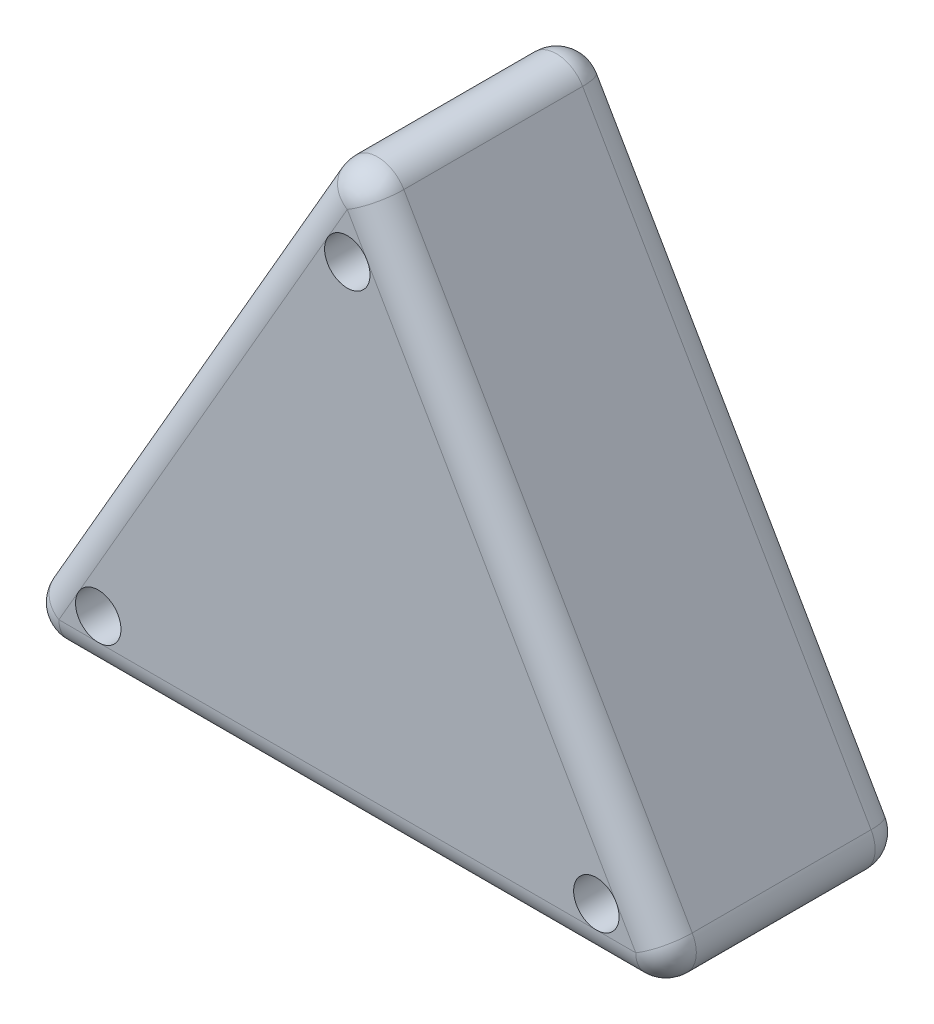
ISO-10303-21;
HEADER;
FILE_DESCRIPTION(('STEP AP214'),'2;1');
FILE_NAME('part.step','',(''),(''),'','','');
FILE_SCHEMA(('AUTOMOTIVE_DESIGN { 1 0 10303 214 1 1 1 1 }'));
ENDSEC;
DATA;
#1=APPLICATION_CONTEXT('core data for automotive mechanical design processes');
#2=APPLICATION_PROTOCOL_DEFINITION('international standard','automotive_design',2000,#1);
#3=PRODUCT_CONTEXT('',#1,'mechanical');
#4=PRODUCT('Part','Part','',(#3));
#5=PRODUCT_RELATED_PRODUCT_CATEGORY('part','',(#4));
#6=PRODUCT_DEFINITION_FORMATION('','',#4);
#7=PRODUCT_DEFINITION_CONTEXT('part definition',#1,'design');
#8=PRODUCT_DEFINITION('design','',#6,#7);
#9=PRODUCT_DEFINITION_SHAPE('','',#8);
#10=(LENGTH_UNIT() NAMED_UNIT(*) SI_UNIT(.MILLI.,.METRE.));
#11=(NAMED_UNIT(*) PLANE_ANGLE_UNIT() SI_UNIT($,.RADIAN.));
#12=(NAMED_UNIT(*) SI_UNIT($,.STERADIAN.) SOLID_ANGLE_UNIT());
#13=UNCERTAINTY_MEASURE_WITH_UNIT(LENGTH_MEASURE(1.E-05),#10,'distance_accuracy_value','');
#14=(GEOMETRIC_REPRESENTATION_CONTEXT(3) GLOBAL_UNCERTAINTY_ASSIGNED_CONTEXT((#13)) GLOBAL_UNIT_ASSIGNED_CONTEXT((#10,
#11,#12)) REPRESENTATION_CONTEXT('',''));
#15=CARTESIAN_POINT('',(0.,0.,0.));
#16=DIRECTION('',(0.,0.,1.));
#17=DIRECTION('',(1.,0.,0.));
#18=AXIS2_PLACEMENT_3D('',#15,#16,#17);
#19=CARTESIAN_POINT('',(22.4999999999999,34.9711431702998,15.8));
#20=DIRECTION('',(0.,0.,-1.));
#21=DIRECTION('',(-1.,0.,0.));
#22=AXIS2_PLACEMENT_3D('',#19,#20,#21);
#23=PLANE('',#22);
#24=DIRECTION('',(0.499999999999998,0.86602540378444,0.));
#25=VECTOR('',#24,1.);
#26=CARTESIAN_POINT('',(3.46410161513774,2.,15.8));
#27=LINE('',#26,#25);
#28=CARTESIAN_POINT('',(4.76313972081451,4.2500000000002,15.8));
#29=VERTEX_POINT('',#28);
#30=CARTESIAN_POINT('',(3.46410161513775,2.,15.8));
#31=VERTEX_POINT('',#30);
#32=EDGE_CURVE('E425',#29,#31,#27,.F.);
#33=ORIENTED_EDGE('',*,*,#32,.T.);
#34=DIRECTION('',(1.,0.,0.));
#35=VECTOR('',#34,1.);
#36=CARTESIAN_POINT('',(22.4999999999999,2.,15.8));
#37=LINE('',#36,#35);
#38=CARTESIAN_POINT('',(6.06217782649106,2.,15.8));
#39=VERTEX_POINT('',#38);
#40=EDGE_CURVE('E255',#31,#39,#37,.T.);
#41=ORIENTED_EDGE('',*,*,#40,.T.);
#42=CARTESIAN_POINT('',(6.06217782649106,3.50000000000027,15.8));
#43=DIRECTION('',(0.,0.,-1.));
#44=DIRECTION('',(-1.,0.,0.));
#45=AXIS2_PLACEMENT_3D('',#42,#43,#44);
#46=CIRCLE('',#45,1.5);
#47=EDGE_CURVE('E348',#39,#29,#46,.T.);
#48=ORIENTED_EDGE('',*,*,#47,.T.);
#49=EDGE_LOOP('',(#33,#41,#48));
#50=FACE_BOUND('',#49,.T.);
#51=ADVANCED_FACE('F104',(#50),#23,.F.);
#52=EDGE_CURVE('E343',#29,#39,#46,.T.);
#53=ORIENTED_EDGE('',*,*,#52,.T.);
#54=DIRECTION('',(1.,0.,0.));
#55=VECTOR('',#54,1.);
#56=CARTESIAN_POINT('',(22.4999999999999,2.,15.8));
#57=LINE('',#56,#55);
#58=CARTESIAN_POINT('',(38.9378221735089,2.,15.8));
#59=VERTEX_POINT('',#58);
#60=EDGE_CURVE('E444',#39,#59,#57,.T.);
#61=ORIENTED_EDGE('',*,*,#60,.T.);
#62=CARTESIAN_POINT('',(38.9378221735089,3.5,15.8));
#63=DIRECTION('',(0.,0.,1.));
#64=DIRECTION('',(1.,0.,0.));
#65=AXIS2_PLACEMENT_3D('',#62,#63,#64);
#66=CIRCLE('',#65,1.5);
#67=CARTESIAN_POINT('',(40.2368602791856,4.25,15.8));
#68=VERTEX_POINT('',#67);
#69=EDGE_CURVE('E333',#68,#59,#66,.T.);
#70=ORIENTED_EDGE('',*,*,#69,.F.);
#71=DIRECTION('',(0.500000000000001,-0.866025403784438,0.));
#72=VECTOR('',#71,1.);
#73=CARTESIAN_POINT('',(22.4999999999999,34.9711431702998,15.8));
#74=LINE('',#73,#72);
#75=CARTESIAN_POINT('',(23.7990381056766,32.7211431702998,15.8));
#76=VERTEX_POINT('',#75);
#77=EDGE_CURVE('E436',#68,#76,#74,.F.);
#78=ORIENTED_EDGE('',*,*,#77,.T.);
#79=CARTESIAN_POINT('',(22.4999999999999,31.9711431702998,15.8));
#80=DIRECTION('',(0.,0.,1.));
#81=DIRECTION('',(1.,0.,0.));
#82=AXIS2_PLACEMENT_3D('',#79,#80,#81);
#83=CIRCLE('',#82,1.5);
#84=CARTESIAN_POINT('',(21.2009618943233,32.7211431702998,15.8));
#85=VERTEX_POINT('',#84);
#86=EDGE_CURVE('E329',#85,#76,#83,.T.);
#87=ORIENTED_EDGE('',*,*,#86,.F.);
#88=DIRECTION('',(0.499999999999998,0.86602540378444,0.));
#89=VECTOR('',#88,1.);
#90=CARTESIAN_POINT('',(3.46410161513774,2.,15.8));
#91=LINE('',#90,#89);
#92=EDGE_CURVE('E428',#85,#29,#91,.F.);
#93=ORIENTED_EDGE('',*,*,#92,.T.);
#94=EDGE_LOOP('',(#53,#61,#70,#78,#87,#93));
#95=FACE_BOUND('',#94,.T.);
#96=ADVANCED_FACE('F465',(#95),#23,.F.);
#97=EDGE_CURVE('E338',#59,#68,#66,.T.);
#98=ORIENTED_EDGE('',*,*,#97,.F.);
#99=DIRECTION('',(1.,0.,0.));
#100=VECTOR('',#99,1.);
#101=CARTESIAN_POINT('',(22.4999999999999,2.,15.8));
#102=LINE('',#101,#100);
#103=CARTESIAN_POINT('',(41.5358983848622,2.,15.8));
#104=VERTEX_POINT('',#103);
#105=EDGE_CURVE('E122',#59,#104,#102,.T.);
#106=ORIENTED_EDGE('',*,*,#105,.T.);
#107=DIRECTION('',(0.500000000000001,-0.866025403784438,0.));
#108=VECTOR('',#107,1.);
#109=CARTESIAN_POINT('',(22.4999999999999,34.9711431702998,15.8));
#110=LINE('',#109,#108);
#111=EDGE_CURVE('E439',#104,#68,#110,.F.);
#112=ORIENTED_EDGE('',*,*,#111,.T.);
#113=EDGE_LOOP('',(#98,#106,#112));
#114=FACE_BOUND('',#113,.T.);
#115=ADVANCED_FACE('F512',(#114),#23,.F.);
#116=CARTESIAN_POINT('',(22.4999999999999,34.9711431702998,0.));
#117=DIRECTION('',(0.,0.,-1.));
#118=DIRECTION('',(-1.,0.,0.));
#119=AXIS2_PLACEMENT_3D('',#116,#117,#118);
#120=PLANE('',#119);
#121=CARTESIAN_POINT('',(22.4999999999999,12.9903810567666,0.));
#122=DIRECTION('',(0.,0.,-1.));
#123=DIRECTION('',(-1.,0.,0.));
#124=AXIS2_PLACEMENT_3D('',#121,#122,#123);
#125=CIRCLE('',#124,10.01);
#126=CARTESIAN_POINT('',(12.4899999999999,12.9903810567666,0.));
#127=VERTEX_POINT('',#126);
#128=EDGE_CURVE('E250',#127,#127,#125,.F.);
#129=ORIENTED_EDGE('',*,*,#128,.T.);
#130=EDGE_LOOP('',(#129));
#131=FACE_BOUND('',#130,.T.);
#132=CARTESIAN_POINT('',(22.4999999999999,31.9711431702998,0.));
#133=DIRECTION('',(0.,0.,1.));
#134=DIRECTION('',(1.,0.,0.));
#135=AXIS2_PLACEMENT_3D('',#132,#133,#134);
#136=CIRCLE('',#135,1.5);
#137=CARTESIAN_POINT('',(21.2009618943233,32.7211431702998,0.));
#138=VERTEX_POINT('',#137);
#139=CARTESIAN_POINT('',(23.7990381056766,32.7211431702998,0.));
#140=VERTEX_POINT('',#139);
#141=EDGE_CURVE('E316',#138,#140,#136,.T.);
#142=ORIENTED_EDGE('',*,*,#141,.T.);
#143=DIRECTION('',(0.500000000000001,-0.866025403784438,0.));
#144=VECTOR('',#143,1.);
#145=CARTESIAN_POINT('',(22.4999999999999,34.9711431702998,0.));
#146=LINE('',#145,#144);
#147=CARTESIAN_POINT('',(40.2368602791856,4.25,0.));
#148=VERTEX_POINT('',#147);
#149=EDGE_CURVE('E404',#140,#148,#146,.T.);
#150=ORIENTED_EDGE('',*,*,#149,.T.);
#151=CARTESIAN_POINT('',(38.9378221735089,3.5,0.));
#152=DIRECTION('',(0.,0.,1.));
#153=DIRECTION('',(1.,0.,0.));
#154=AXIS2_PLACEMENT_3D('',#151,#152,#153);
#155=CIRCLE('',#154,1.5);
#156=CARTESIAN_POINT('',(38.9378221735089,2.,0.));
#157=VERTEX_POINT('',#156);
#158=EDGE_CURVE('E339',#148,#157,#155,.T.);
#159=ORIENTED_EDGE('',*,*,#158,.T.);
#160=DIRECTION('',(1.,0.,0.));
#161=VECTOR('',#160,1.);
#162=CARTESIAN_POINT('',(3.46410161513775,2.,0.));
#163=LINE('',#162,#161);
#164=CARTESIAN_POINT('',(6.06217782649106,2.,0.));
#165=VERTEX_POINT('',#164);
#166=EDGE_CURVE('E394',#157,#165,#163,.F.);
#167=ORIENTED_EDGE('',*,*,#166,.T.);
#168=CARTESIAN_POINT('',(6.06217782649106,3.50000000000027,0.));
#169=DIRECTION('',(0.,0.,-1.));
#170=DIRECTION('',(-1.,0.,0.));
#171=AXIS2_PLACEMENT_3D('',#168,#169,#170);
#172=CIRCLE('',#171,1.5);
#173=CARTESIAN_POINT('',(4.7631397208145,4.25000000000021,0.));
#174=VERTEX_POINT('',#173);
#175=EDGE_CURVE('E349',#174,#165,#172,.T.);
#176=ORIENTED_EDGE('',*,*,#175,.F.);
#177=DIRECTION('',(0.499999999999998,0.86602540378444,0.));
#178=VECTOR('',#177,1.);
#179=CARTESIAN_POINT('',(22.4999999999999,34.9711431702998,0.));
#180=LINE('',#179,#178);
#181=EDGE_CURVE('E382',#174,#138,#180,.T.);
#182=ORIENTED_EDGE('',*,*,#181,.T.);
#183=EDGE_LOOP('',(#142,#150,#159,#167,#176,#182));
#184=FACE_BOUND('',#183,.T.);
#185=ADVANCED_FACE('F488',(#131,#184),#120,.T.);
#186=EDGE_CURVE('E328',#157,#148,#155,.T.);
#187=ORIENTED_EDGE('',*,*,#186,.T.);
#188=DIRECTION('',(0.500000000000001,-0.866025403784438,0.));
#189=VECTOR('',#188,1.);
#190=CARTESIAN_POINT('',(22.4999999999999,34.9711431702998,0.));
#191=LINE('',#190,#189);
#192=CARTESIAN_POINT('',(41.5358983848622,2.,0.));
#193=VERTEX_POINT('',#192);
#194=EDGE_CURVE('E401',#148,#193,#191,.T.);
#195=ORIENTED_EDGE('',*,*,#194,.T.);
#196=DIRECTION('',(1.,0.,0.));
#197=VECTOR('',#196,1.);
#198=CARTESIAN_POINT('',(3.46410161513775,2.,0.));
#199=LINE('',#198,#197);
#200=EDGE_CURVE('E397',#193,#157,#199,.F.);
#201=ORIENTED_EDGE('',*,*,#200,.T.);
#202=EDGE_LOOP('',(#187,#195,#201));
#203=FACE_BOUND('',#202,.T.);
#204=ADVANCED_FACE('F492',(#203),#120,.T.);
#205=EDGE_CURVE('E337',#165,#174,#172,.T.);
#206=ORIENTED_EDGE('',*,*,#205,.F.);
#207=DIRECTION('',(1.,0.,0.));
#208=VECTOR('',#207,1.);
#209=CARTESIAN_POINT('',(3.46410161513775,2.,0.));
#210=LINE('',#209,#208);
#211=CARTESIAN_POINT('',(3.46410161513773,2.00000000000001,0.));
#212=VERTEX_POINT('',#211);
#213=EDGE_CURVE('E391',#165,#212,#210,.F.);
#214=ORIENTED_EDGE('',*,*,#213,.T.);
#215=DIRECTION('',(0.499999999999998,0.86602540378444,0.));
#216=VECTOR('',#215,1.);
#217=CARTESIAN_POINT('',(22.4999999999999,34.9711431702998,0.));
#218=LINE('',#217,#216);
#219=EDGE_CURVE('E385',#212,#174,#218,.T.);
#220=ORIENTED_EDGE('',*,*,#219,.T.);
#221=EDGE_LOOP('',(#206,#214,#220));
#222=FACE_BOUND('',#221,.T.);
#223=ADVANCED_FACE('F516',(#222),#120,.T.);
#224=EDGE_CURVE('E325',#76,#85,#83,.T.);
#225=ORIENTED_EDGE('',*,*,#224,.F.);
#226=DIRECTION('',(0.500000000000001,-0.866025403784438,0.));
#227=VECTOR('',#226,1.);
#228=CARTESIAN_POINT('',(22.4999999999999,34.9711431702998,15.8));
#229=LINE('',#228,#227);
#230=CARTESIAN_POINT('',(22.4999999999999,34.9711431702998,15.8));
#231=VERTEX_POINT('',#230);
#232=EDGE_CURVE('E130',#76,#231,#229,.F.);
#233=ORIENTED_EDGE('',*,*,#232,.T.);
#234=DIRECTION('',(0.499999999999998,0.86602540378444,0.));
#235=VECTOR('',#234,1.);
#236=CARTESIAN_POINT('',(3.46410161513774,2.,15.8));
#237=LINE('',#236,#235);
#238=EDGE_CURVE('E431',#231,#85,#237,.F.);
#239=ORIENTED_EDGE('',*,*,#238,.T.);
#240=EDGE_LOOP('',(#225,#233,#239));
#241=FACE_BOUND('',#240,.T.);
#242=ADVANCED_FACE('F462',(#241),#23,.F.);
#243=DIRECTION('',(0.499999999999998,0.86602540378444,0.));
#244=VECTOR('',#243,1.);
#245=CARTESIAN_POINT('',(22.4999999999999,34.9711431702998,0.));
#246=LINE('',#245,#244);
#247=CARTESIAN_POINT('',(22.4999999999999,34.9711431702998,0.));
#248=VERTEX_POINT('',#247);
#249=EDGE_CURVE('E379',#138,#248,#246,.T.);
#250=ORIENTED_EDGE('',*,*,#249,.T.);
#251=DIRECTION('',(0.500000000000001,-0.866025403784438,0.));
#252=VECTOR('',#251,1.);
#253=CARTESIAN_POINT('',(22.4999999999999,34.9711431702998,0.));
#254=LINE('',#253,#252);
#255=EDGE_CURVE('E388',#248,#140,#254,.T.);
#256=ORIENTED_EDGE('',*,*,#255,.T.);
#257=EDGE_CURVE('E322',#140,#138,#136,.T.);
#258=ORIENTED_EDGE('',*,*,#257,.T.);
#259=EDGE_LOOP('',(#250,#256,#258));
#260=FACE_BOUND('',#259,.T.);
#261=ADVANCED_FACE('F515',(#260),#120,.T.);
#262=CARTESIAN_POINT('',(22.4999999999999,34.9711431702998,15.8));
#263=DIRECTION('',(0.,0.,-1.));
#264=DIRECTION('',(-1.,0.,0.));
#265=AXIS2_PLACEMENT_3D('',#262,#263,#264);
#266=CYLINDRICAL_SURFACE('',#265,1.99999999999999);
#267=DIRECTION('',(0.,0.,-1.));
#268=VECTOR('',#267,1.);
#269=CARTESIAN_POINT('',(24.2320508075688,35.9711431702998,15.8));
#270=LINE('',#269,#268);
#271=CARTESIAN_POINT('',(24.2320508075688,35.9711431702998,13.8));
#272=VERTEX_POINT('',#271);
#273=CARTESIAN_POINT('',(24.2320508075688,35.9711431702998,2.));
#274=VERTEX_POINT('',#273);
#275=EDGE_CURVE('E347',#272,#274,#270,.T.);
#276=ORIENTED_EDGE('',*,*,#275,.T.);
#277=CARTESIAN_POINT('',(22.4999999999999,34.9711431702998,2.));
#278=DIRECTION('',(0.,0.,-1.));
#279=DIRECTION('',(-1.,0.,0.));
#280=AXIS2_PLACEMENT_3D('',#277,#278,#279);
#281=CIRCLE('',#280,1.99999999999999);
#282=CARTESIAN_POINT('',(20.767949192431,35.9711431702998,2.));
#283=VERTEX_POINT('',#282);
#284=EDGE_CURVE('E422',#274,#283,#281,.F.);
#285=ORIENTED_EDGE('',*,*,#284,.T.);
#286=DIRECTION('',(0.,0.,-1.));
#287=VECTOR('',#286,1.);
#288=CARTESIAN_POINT('',(20.767949192431,35.9711431702998,15.8));
#289=LINE('',#288,#287);
#290=CARTESIAN_POINT('',(20.767949192431,35.9711431702998,13.8));
#291=VERTEX_POINT('',#290);
#292=EDGE_CURVE('E353',#291,#283,#289,.T.);
#293=ORIENTED_EDGE('',*,*,#292,.F.);
#294=CARTESIAN_POINT('',(22.4999999999999,34.9711431702998,13.8));
#295=DIRECTION('',(0.,0.,-1.));
#296=DIRECTION('',(-1.,0.,0.));
#297=AXIS2_PLACEMENT_3D('',#294,#295,#296);
#298=CIRCLE('',#297,1.99999999999999);
#299=EDGE_CURVE('E419',#291,#272,#298,.T.);
#300=ORIENTED_EDGE('',*,*,#299,.T.);
#301=EDGE_LOOP('',(#276,#285,#293,#300));
#302=FACE_BOUND('',#301,.T.);
#303=ADVANCED_FACE('F454',(#302),#266,.T.);
#304=CARTESIAN_POINT('',(1.73205080756887,3.,15.8));
#305=DIRECTION('',(-0.86602540378444,0.499999999999998,0.));
#306=DIRECTION('',(-0.499999999999998,-0.86602540378444,0.));
#307=AXIS2_PLACEMENT_3D('',#304,#305,#306);
#308=PLANE('',#307);
#309=ORIENTED_EDGE('',*,*,#292,.T.);
#310=DIRECTION('',(0.499999999999998,0.86602540378444,0.));
#311=VECTOR('',#310,1.);
#312=CARTESIAN_POINT('',(1.73205080756887,3.,2.));
#313=LINE('',#312,#311);
#314=CARTESIAN_POINT('',(1.73205080756886,3.,2.));
#315=VERTEX_POINT('',#314);
#316=EDGE_CURVE('E12',#283,#315,#313,.F.);
#317=ORIENTED_EDGE('',*,*,#316,.T.);
#318=DIRECTION('',(0.,0.,-1.));
#319=VECTOR('',#318,1.);
#320=CARTESIAN_POINT('',(1.73205080756886,3.,15.8));
#321=LINE('',#320,#319);
#322=CARTESIAN_POINT('',(1.73205080756886,3.,13.8));
#323=VERTEX_POINT('',#322);
#324=EDGE_CURVE('E240',#323,#315,#321,.T.);
#325=ORIENTED_EDGE('',*,*,#324,.F.);
#326=DIRECTION('',(0.499999999999998,0.86602540378444,0.));
#327=VECTOR('',#326,1.);
#328=CARTESIAN_POINT('',(20.767949192431,35.9711431702998,13.8));
#329=LINE('',#328,#327);
#330=EDGE_CURVE('E114',#323,#291,#329,.T.);
#331=ORIENTED_EDGE('',*,*,#330,.T.);
#332=EDGE_LOOP('',(#309,#317,#325,#331));
#333=FACE_BOUND('',#332,.T.);
#334=ADVANCED_FACE('F451',(#333),#308,.T.);
#335=CARTESIAN_POINT('',(3.46410161513775,2.,15.8));
#336=DIRECTION('',(0.,0.,-1.));
#337=DIRECTION('',(-1.,0.,0.));
#338=AXIS2_PLACEMENT_3D('',#335,#336,#337);
#339=CYLINDRICAL_SURFACE('',#338,2.);
#340=ORIENTED_EDGE('',*,*,#324,.T.);
#341=CARTESIAN_POINT('',(3.46410161513775,2.,2.));
#342=DIRECTION('',(0.,0.,-1.));
#343=DIRECTION('',(-1.,0.,0.));
#344=AXIS2_PLACEMENT_3D('',#341,#342,#343);
#345=CIRCLE('',#344,2.);
#346=CARTESIAN_POINT('',(3.46410161513775,0.,2.));
#347=VERTEX_POINT('',#346);
#348=EDGE_CURVE('E228',#315,#347,#345,.F.);
#349=ORIENTED_EDGE('',*,*,#348,.T.);
#350=DIRECTION('',(0.,0.,-1.));
#351=VECTOR('',#350,1.);
#352=CARTESIAN_POINT('',(3.46410161513775,0.,15.8));
#353=LINE('',#352,#351);
#354=CARTESIAN_POINT('',(3.46410161513775,0.,13.8));
#355=VERTEX_POINT('',#354);
#356=EDGE_CURVE('E219',#355,#347,#353,.T.);
#357=ORIENTED_EDGE('',*,*,#356,.F.);
#358=CARTESIAN_POINT('',(3.46410161513775,2.,13.8));
#359=DIRECTION('',(0.,0.,-1.));
#360=DIRECTION('',(-1.,0.,0.));
#361=AXIS2_PLACEMENT_3D('',#358,#359,#360);
#362=CIRCLE('',#361,2.);
#363=EDGE_CURVE('E236',#355,#323,#362,.T.);
#364=ORIENTED_EDGE('',*,*,#363,.T.);
#365=EDGE_LOOP('',(#340,#349,#357,#364));
#366=FACE_BOUND('',#365,.T.);
#367=ADVANCED_FACE('F235',(#366),#339,.T.);
#368=CARTESIAN_POINT('',(3.46410161513775,0.,15.8));
#369=DIRECTION('',(0.,1.,0.));
#370=DIRECTION('',(0.,0.,1.));
#371=AXIS2_PLACEMENT_3D('',#368,#369,#370);
#372=PLANE('',#371);
#373=ORIENTED_EDGE('',*,*,#356,.T.);
#374=DIRECTION('',(1.,0.,0.));
#375=VECTOR('',#374,1.);
#376=CARTESIAN_POINT('',(41.5358983848622,0.,2.));
#377=LINE('',#376,#375);
#378=CARTESIAN_POINT('',(41.5358983848622,0.,2.));
#379=VERTEX_POINT('',#378);
#380=EDGE_CURVE('E227',#347,#379,#377,.T.);
#381=ORIENTED_EDGE('',*,*,#380,.T.);
#382=DIRECTION('',(0.,0.,-1.));
#383=VECTOR('',#382,1.);
#384=CARTESIAN_POINT('',(41.5358983848622,0.,15.8));
#385=LINE('',#384,#383);
#386=CARTESIAN_POINT('',(41.5358983848622,0.,13.8));
#387=VERTEX_POINT('',#386);
#388=EDGE_CURVE('E221',#387,#379,#385,.T.);
#389=ORIENTED_EDGE('',*,*,#388,.F.);
#390=DIRECTION('',(1.,0.,0.));
#391=VECTOR('',#390,1.);
#392=CARTESIAN_POINT('',(3.46410161513775,0.,13.8));
#393=LINE('',#392,#391);
#394=EDGE_CURVE('E216',#387,#355,#393,.F.);
#395=ORIENTED_EDGE('',*,*,#394,.T.);
#396=EDGE_LOOP('',(#373,#381,#389,#395));
#397=FACE_BOUND('',#396,.T.);
#398=ADVANCED_FACE('F218',(#397),#372,.F.);
#399=CARTESIAN_POINT('',(41.5358983848622,2.,15.8));
#400=DIRECTION('',(0.,0.,-1.));
#401=DIRECTION('',(-1.,0.,0.));
#402=AXIS2_PLACEMENT_3D('',#399,#400,#401);
#403=CYLINDRICAL_SURFACE('',#402,2.);
#404=ORIENTED_EDGE('',*,*,#388,.T.);
#405=CARTESIAN_POINT('',(41.5358983848622,2.,2.));
#406=DIRECTION('',(0.,0.,-1.));
#407=DIRECTION('',(-1.,0.,0.));
#408=AXIS2_PLACEMENT_3D('',#405,#406,#407);
#409=CIRCLE('',#408,2.);
#410=CARTESIAN_POINT('',(43.2679491924311,3.00000000000001,2.));
#411=VERTEX_POINT('',#410);
#412=EDGE_CURVE('E410',#379,#411,#409,.F.);
#413=ORIENTED_EDGE('',*,*,#412,.T.);
#414=DIRECTION('',(0.,0.,-1.));
#415=VECTOR('',#414,1.);
#416=CARTESIAN_POINT('',(43.2679491924311,3.00000000000001,15.8));
#417=LINE('',#416,#415);
#418=CARTESIAN_POINT('',(43.2679491924311,3.00000000000001,13.8));
#419=VERTEX_POINT('',#418);
#420=EDGE_CURVE('E362',#419,#411,#417,.T.);
#421=ORIENTED_EDGE('',*,*,#420,.F.);
#422=CARTESIAN_POINT('',(41.5358983848622,2.,13.8));
#423=DIRECTION('',(0.,0.,-1.));
#424=DIRECTION('',(-1.,0.,0.));
#425=AXIS2_PLACEMENT_3D('',#422,#423,#424);
#426=CIRCLE('',#425,2.);
#427=EDGE_CURVE('E407',#419,#387,#426,.T.);
#428=ORIENTED_EDGE('',*,*,#427,.T.);
#429=EDGE_LOOP('',(#404,#413,#421,#428));
#430=FACE_BOUND('',#429,.T.);
#431=ADVANCED_FACE('F532',(#430),#403,.T.);
#432=CARTESIAN_POINT('',(24.2320508075688,35.9711431702998,15.8));
#433=DIRECTION('',(0.866025403784438,0.500000000000001,0.));
#434=DIRECTION('',(-0.500000000000001,0.866025403784438,0.));
#435=AXIS2_PLACEMENT_3D('',#432,#433,#434);
#436=PLANE('',#435);
#437=ORIENTED_EDGE('',*,*,#420,.T.);
#438=DIRECTION('',(0.500000000000001,-0.866025403784438,0.));
#439=VECTOR('',#438,1.);
#440=CARTESIAN_POINT('',(24.2320508075688,35.9711431702998,2.));
#441=LINE('',#440,#439);
#442=EDGE_CURVE('E416',#411,#274,#441,.F.);
#443=ORIENTED_EDGE('',*,*,#442,.T.);
#444=ORIENTED_EDGE('',*,*,#275,.F.);
#445=DIRECTION('',(0.500000000000001,-0.866025403784438,0.));
#446=VECTOR('',#445,1.);
#447=CARTESIAN_POINT('',(43.2679491924311,3.,13.8));
#448=LINE('',#447,#446);
#449=EDGE_CURVE('E413',#272,#419,#448,.T.);
#450=ORIENTED_EDGE('',*,*,#449,.T.);
#451=EDGE_LOOP('',(#437,#443,#444,#450));
#452=FACE_BOUND('',#451,.T.);
#453=ADVANCED_FACE('F503',(#452),#436,.T.);
#454=CARTESIAN_POINT('',(6.06217782649106,3.50000000000027,15.8));
#455=DIRECTION('',(0.,0.,-1.));
#456=DIRECTION('',(-1.,0.,0.));
#457=AXIS2_PLACEMENT_3D('',#454,#455,#456);
#458=CYLINDRICAL_SURFACE('',#457,1.5);
#459=ORIENTED_EDGE('',*,*,#52,.F.);
#460=ORIENTED_EDGE('',*,*,#47,.F.);
#461=EDGE_LOOP('',(#459,#460));
#462=FACE_BOUND('',#461,.T.);
#463=ORIENTED_EDGE('',*,*,#175,.T.);
#464=ORIENTED_EDGE('',*,*,#205,.T.);
#465=EDGE_LOOP('',(#463,#464));
#466=FACE_BOUND('',#465,.T.);
#467=ADVANCED_FACE('F497',(#462,#466),#458,.F.);
#468=CARTESIAN_POINT('',(38.9378221735089,3.5,15.8));
#469=DIRECTION('',(0.,0.,-1.));
#470=DIRECTION('',(-1.,0.,0.));
#471=AXIS2_PLACEMENT_3D('',#468,#469,#470);
#472=CYLINDRICAL_SURFACE('',#471,1.5);
#473=ORIENTED_EDGE('',*,*,#69,.T.);
#474=ORIENTED_EDGE('',*,*,#97,.T.);
#475=EDGE_LOOP('',(#473,#474));
#476=FACE_BOUND('',#475,.T.);
#477=ORIENTED_EDGE('',*,*,#158,.F.);
#478=ORIENTED_EDGE('',*,*,#186,.F.);
#479=EDGE_LOOP('',(#477,#478));
#480=FACE_BOUND('',#479,.T.);
#481=ADVANCED_FACE('F475',(#476,#480),#472,.F.);
#482=CARTESIAN_POINT('',(22.4999999999999,31.9711431702998,15.8));
#483=DIRECTION('',(0.,0.,-1.));
#484=DIRECTION('',(-1.,0.,0.));
#485=AXIS2_PLACEMENT_3D('',#482,#483,#484);
#486=CYLINDRICAL_SURFACE('',#485,1.5);
#487=ORIENTED_EDGE('',*,*,#224,.T.);
#488=ORIENTED_EDGE('',*,*,#86,.T.);
#489=EDGE_LOOP('',(#487,#488));
#490=FACE_BOUND('',#489,.T.);
#491=ORIENTED_EDGE('',*,*,#257,.F.);
#492=ORIENTED_EDGE('',*,*,#141,.F.);
#493=EDGE_LOOP('',(#491,#492));
#494=FACE_BOUND('',#493,.T.);
#495=ADVANCED_FACE('F471',(#490,#494),#486,.F.);
#496=CARTESIAN_POINT('',(22.4999999999999,12.9903810567666,9.8));
#497=DIRECTION('',(0.,0.,-1.));
#498=DIRECTION('',(-1.,0.,0.));
#499=AXIS2_PLACEMENT_3D('',#496,#497,#498);
#500=CYLINDRICAL_SURFACE('',#499,9.01);
#501=CARTESIAN_POINT('',(22.4999999999999,12.9903810567666,1.00000000000002));
#502=DIRECTION('',(0.,0.,-1.));
#503=DIRECTION('',(-1.,0.,0.));
#504=AXIS2_PLACEMENT_3D('',#501,#502,#503);
#505=CIRCLE('',#504,9.01);
#506=CARTESIAN_POINT('',(13.4899999999999,12.9903810567666,1.00000000000002));
#507=VERTEX_POINT('',#506);
#508=EDGE_CURVE('E357',#507,#507,#505,.T.);
#509=ORIENTED_EDGE('',*,*,#508,.T.);
#510=EDGE_LOOP('',(#509));
#511=FACE_BOUND('',#510,.T.);
#512=CARTESIAN_POINT('',(22.4999999999999,12.9903810567666,9.8));
#513=DIRECTION('',(0.,0.,-1.));
#514=DIRECTION('',(-1.,0.,0.));
#515=AXIS2_PLACEMENT_3D('',#512,#513,#514);
#516=CIRCLE('',#515,9.01);
#517=CARTESIAN_POINT('',(13.4899999999999,12.9903810567666,9.8));
#518=VERTEX_POINT('',#517);
#519=EDGE_CURVE('E309',#518,#518,#516,.T.);
#520=ORIENTED_EDGE('',*,*,#519,.F.);
#521=EDGE_LOOP('',(#520));
#522=FACE_BOUND('',#521,.T.);
#523=ADVANCED_FACE('F474',(#511,#522),#500,.F.);
#524=CARTESIAN_POINT('',(22.4999999999999,12.9903810567666,9.8));
#525=DIRECTION('',(0.,0.,-1.));
#526=DIRECTION('',(-1.,0.,0.));
#527=AXIS2_PLACEMENT_3D('',#524,#525,#526);
#528=PLANE('',#527);
#529=ORIENTED_EDGE('',*,*,#519,.T.);
#530=EDGE_LOOP('',(#529));
#531=FACE_BOUND('',#530,.T.);
#532=ADVANCED_FACE('F677',(#531),#528,.T.);
#533=CARTESIAN_POINT('',(22.4999999999999,12.9903810567666,1.00000000000002));
#534=DIRECTION('',(0.,0.,-1.));
#535=DIRECTION('',(-1.,0.,0.));
#536=AXIS2_PLACEMENT_3D('',#533,#534,#535);
#537=CONICAL_SURFACE('',#536,9.01,0.785398163397447);
#538=ORIENTED_EDGE('',*,*,#128,.F.);
#539=EDGE_LOOP('',(#538));
#540=FACE_BOUND('',#539,.T.);
#541=ORIENTED_EDGE('',*,*,#508,.F.);
#542=EDGE_LOOP('',(#541));
#543=FACE_BOUND('',#542,.T.);
#544=ADVANCED_FACE('F556',(#540,#543),#537,.F.);
#545=CARTESIAN_POINT('',(22.4999999999999,34.9711431702998,2.));
#546=DIRECTION('',(0.500000000000001,-0.866025403784438,0.));
#547=DIRECTION('',(0.866025403784438,0.500000000000001,0.));
#548=AXIS2_PLACEMENT_3D('',#545,#546,#547);
#549=CYLINDRICAL_SURFACE('',#548,2.);
#550=CARTESIAN_POINT('',(22.4999999999999,34.9711431702998,2.));
#551=DIRECTION('',(-0.500000000000001,0.866025403784438,0.));
#552=DIRECTION('',(-0.866025403784438,-0.500000000000001,0.));
#553=AXIS2_PLACEMENT_3D('',#550,#551,#552);
#554=CIRCLE('',#553,2.);
#555=EDGE_CURVE('E262',#274,#248,#554,.T.);
#556=ORIENTED_EDGE('',*,*,#555,.F.);
#557=ORIENTED_EDGE('',*,*,#442,.F.);
#558=CARTESIAN_POINT('',(41.5358983848622,2.,2.));
#559=DIRECTION('',(0.500000000000002,-0.866025403784437,0.));
#560=DIRECTION('',(0.866025403784437,0.500000000000002,0.));
#561=AXIS2_PLACEMENT_3D('',#558,#559,#560);
#562=CIRCLE('',#561,2.);
#563=EDGE_CURVE('E300',#193,#411,#562,.T.);
#564=ORIENTED_EDGE('',*,*,#563,.F.);
#565=ORIENTED_EDGE('',*,*,#194,.F.);
#566=ORIENTED_EDGE('',*,*,#149,.F.);
#567=ORIENTED_EDGE('',*,*,#255,.F.);
#568=EDGE_LOOP('',(#556,#557,#564,#565,#566,#567));
#569=FACE_BOUND('',#568,.T.);
#570=ADVANCED_FACE('F485',(#569),#549,.T.);
#571=CARTESIAN_POINT('',(22.4999999999999,34.9711431702998,2.));
#572=DIRECTION('',(0.,0.,-1.));
#573=DIRECTION('',(-1.,0.,0.));
#574=AXIS2_PLACEMENT_3D('',#571,#572,#573);
#575=SPHERICAL_SURFACE('',#574,2.);
#576=ORIENTED_EDGE('',*,*,#284,.F.);
#577=ORIENTED_EDGE('',*,*,#555,.T.);
#578=CARTESIAN_POINT('',(22.4999999999999,34.9711431702998,2.));
#579=DIRECTION('',(-0.499999999999997,-0.86602540378444,0.));
#580=DIRECTION('',(0.866025403784441,-0.499999999999997,0.));
#581=AXIS2_PLACEMENT_3D('',#578,#579,#580);
#582=CIRCLE('',#581,2.);
#583=EDGE_CURVE('E297',#283,#248,#582,.T.);
#584=ORIENTED_EDGE('',*,*,#583,.F.);
#585=EDGE_LOOP('',(#576,#577,#584));
#586=FACE_BOUND('',#585,.T.);
#587=ADVANCED_FACE('F537',(#586),#575,.T.);
#588=CARTESIAN_POINT('',(41.5358983848622,2.,2.));
#589=DIRECTION('',(0.,0.,-1.));
#590=DIRECTION('',(-1.,0.,0.));
#591=AXIS2_PLACEMENT_3D('',#588,#589,#590);
#592=SPHERICAL_SURFACE('',#591,2.);
#593=ORIENTED_EDGE('',*,*,#563,.T.);
#594=ORIENTED_EDGE('',*,*,#412,.F.);
#595=CARTESIAN_POINT('',(41.5358983848622,2.,2.));
#596=DIRECTION('',(-1.,0.,0.));
#597=DIRECTION('',(0.,-1.,0.));
#598=AXIS2_PLACEMENT_3D('',#595,#596,#597);
#599=CIRCLE('',#598,2.);
#600=EDGE_CURVE('E290',#193,#379,#599,.T.);
#601=ORIENTED_EDGE('',*,*,#600,.F.);
#602=EDGE_LOOP('',(#593,#594,#601));
#603=FACE_BOUND('',#602,.T.);
#604=ADVANCED_FACE('F561',(#603),#592,.T.);
#605=CARTESIAN_POINT('',(22.4999999999999,34.9711431702998,2.));
#606=DIRECTION('',(0.499999999999998,0.86602540378444,0.));
#607=DIRECTION('',(-0.86602540378444,0.499999999999998,0.));
#608=AXIS2_PLACEMENT_3D('',#605,#606,#607);
#609=CYLINDRICAL_SURFACE('',#608,2.);
#610=ORIENTED_EDGE('',*,*,#181,.F.);
#611=ORIENTED_EDGE('',*,*,#219,.F.);
#612=CARTESIAN_POINT('',(3.46410161513774,2.,2.));
#613=DIRECTION('',(-0.499999999999998,-0.86602540378444,0.));
#614=DIRECTION('',(0.86602540378444,-0.499999999999998,0.));
#615=AXIS2_PLACEMENT_3D('',#612,#613,#614);
#616=CIRCLE('',#615,2.);
#617=EDGE_CURVE('E283',#315,#212,#616,.T.);
#618=ORIENTED_EDGE('',*,*,#617,.F.);
#619=ORIENTED_EDGE('',*,*,#316,.F.);
#620=ORIENTED_EDGE('',*,*,#583,.T.);
#621=ORIENTED_EDGE('',*,*,#249,.F.);
#622=EDGE_LOOP('',(#610,#611,#618,#619,#620,#621));
#623=FACE_BOUND('',#622,.T.);
#624=ADVANCED_FACE('F542',(#623),#609,.T.);
#625=CARTESIAN_POINT('',(3.46410161513775,2.,2.));
#626=DIRECTION('',(-1.,0.,0.));
#627=DIRECTION('',(0.,0.,1.));
#628=AXIS2_PLACEMENT_3D('',#625,#626,#627);
#629=CYLINDRICAL_SURFACE('',#628,2.);
#630=ORIENTED_EDGE('',*,*,#600,.T.);
#631=ORIENTED_EDGE('',*,*,#380,.F.);
#632=CARTESIAN_POINT('',(3.46410161513775,2.,2.));
#633=DIRECTION('',(-1.,0.,0.));
#634=DIRECTION('',(0.,0.,1.));
#635=AXIS2_PLACEMENT_3D('',#632,#633,#634);
#636=CIRCLE('',#635,2.);
#637=EDGE_CURVE('E278',#212,#347,#636,.T.);
#638=ORIENTED_EDGE('',*,*,#637,.F.);
#639=ORIENTED_EDGE('',*,*,#213,.F.);
#640=ORIENTED_EDGE('',*,*,#166,.F.);
#641=ORIENTED_EDGE('',*,*,#200,.F.);
#642=EDGE_LOOP('',(#630,#631,#638,#639,#640,#641));
#643=FACE_BOUND('',#642,.T.);
#644=ADVANCED_FACE('F546',(#643),#629,.T.);
#645=CARTESIAN_POINT('',(3.46410161513775,2.,2.));
#646=DIRECTION('',(0.,0.,-1.));
#647=DIRECTION('',(-1.,0.,0.));
#648=AXIS2_PLACEMENT_3D('',#645,#646,#647);
#649=SPHERICAL_SURFACE('',#648,2.);
#650=ORIENTED_EDGE('',*,*,#348,.F.);
#651=ORIENTED_EDGE('',*,*,#617,.T.);
#652=ORIENTED_EDGE('',*,*,#637,.T.);
#653=EDGE_LOOP('',(#650,#651,#652));
#654=FACE_BOUND('',#653,.T.);
#655=ADVANCED_FACE('F544',(#654),#649,.T.);
#656=CARTESIAN_POINT('',(22.4999999999999,34.9711431702998,13.8));
#657=DIRECTION('',(-0.500000000000001,0.866025403784438,0.));
#658=DIRECTION('',(-0.866025403784438,-0.500000000000001,0.));
#659=AXIS2_PLACEMENT_3D('',#656,#657,#658);
#660=CYLINDRICAL_SURFACE('',#659,2.);
#661=CARTESIAN_POINT('',(41.5358983848622,2.,13.8));
#662=DIRECTION('',(0.500000000000001,-0.866025403784438,0.));
#663=DIRECTION('',(0.866025403784438,0.500000000000001,0.));
#664=AXIS2_PLACEMENT_3D('',#661,#662,#663);
#665=CIRCLE('',#664,2.);
#666=EDGE_CURVE('E270',#419,#104,#665,.T.);
#667=ORIENTED_EDGE('',*,*,#666,.F.);
#668=ORIENTED_EDGE('',*,*,#449,.F.);
#669=CARTESIAN_POINT('',(22.4999999999999,34.9711431702998,13.8));
#670=DIRECTION('',(-0.500000000000001,0.866025403784438,0.));
#671=DIRECTION('',(-0.866025403784438,-0.500000000000001,0.));
#672=AXIS2_PLACEMENT_3D('',#669,#670,#671);
#673=CIRCLE('',#672,2.);
#674=EDGE_CURVE('E108',#231,#272,#673,.T.);
#675=ORIENTED_EDGE('',*,*,#674,.F.);
#676=ORIENTED_EDGE('',*,*,#232,.F.);
#677=ORIENTED_EDGE('',*,*,#77,.F.);
#678=ORIENTED_EDGE('',*,*,#111,.F.);
#679=EDGE_LOOP('',(#667,#668,#675,#676,#677,#678));
#680=FACE_BOUND('',#679,.T.);
#681=ADVANCED_FACE('F106',(#680),#660,.T.);
#682=CARTESIAN_POINT('',(22.4999999999999,34.9711431702998,13.8));
#683=DIRECTION('',(0.,0.,-1.));
#684=DIRECTION('',(-1.,0.,0.));
#685=AXIS2_PLACEMENT_3D('',#682,#683,#684);
#686=SPHERICAL_SURFACE('',#685,2.);
#687=ORIENTED_EDGE('',*,*,#674,.T.);
#688=ORIENTED_EDGE('',*,*,#299,.F.);
#689=CARTESIAN_POINT('',(22.4999999999999,34.9711431702998,13.8));
#690=DIRECTION('',(-0.499999999999996,-0.866025403784441,0.));
#691=DIRECTION('',(0.866025403784441,-0.499999999999996,0.));
#692=AXIS2_PLACEMENT_3D('',#689,#690,#691);
#693=CIRCLE('',#692,2.);
#694=EDGE_CURVE('E267',#231,#291,#693,.T.);
#695=ORIENTED_EDGE('',*,*,#694,.F.);
#696=EDGE_LOOP('',(#687,#688,#695));
#697=FACE_BOUND('',#696,.T.);
#698=ADVANCED_FACE('F456',(#697),#686,.T.);
#699=CARTESIAN_POINT('',(41.5358983848622,2.,13.8));
#700=DIRECTION('',(0.,0.,-1.));
#701=DIRECTION('',(-1.,0.,0.));
#702=AXIS2_PLACEMENT_3D('',#699,#700,#701);
#703=SPHERICAL_SURFACE('',#702,2.);
#704=ORIENTED_EDGE('',*,*,#427,.F.);
#705=ORIENTED_EDGE('',*,*,#666,.T.);
#706=CARTESIAN_POINT('',(41.5358983848622,2.,13.8));
#707=DIRECTION('',(-1.,0.,0.));
#708=DIRECTION('',(0.,-1.,0.));
#709=AXIS2_PLACEMENT_3D('',#706,#707,#708);
#710=CIRCLE('',#709,2.);
#711=EDGE_CURVE('E259',#387,#104,#710,.T.);
#712=ORIENTED_EDGE('',*,*,#711,.F.);
#713=EDGE_LOOP('',(#704,#705,#712));
#714=FACE_BOUND('',#713,.T.);
#715=ADVANCED_FACE('F529',(#714),#703,.T.);
#716=CARTESIAN_POINT('',(3.46410161513775,2.,13.8));
#717=DIRECTION('',(-0.499999999999998,-0.86602540378444,0.));
#718=DIRECTION('',(0.86602540378444,-0.499999999999998,0.));
#719=AXIS2_PLACEMENT_3D('',#716,#717,#718);
#720=CYLINDRICAL_SURFACE('',#719,2.);
#721=ORIENTED_EDGE('',*,*,#694,.T.);
#722=ORIENTED_EDGE('',*,*,#330,.F.);
#723=CARTESIAN_POINT('',(3.46410161513775,2.,13.8));
#724=DIRECTION('',(-0.499999999999998,-0.86602540378444,0.));
#725=DIRECTION('',(0.86602540378444,-0.499999999999998,0.));
#726=AXIS2_PLACEMENT_3D('',#723,#724,#725);
#727=CIRCLE('',#726,2.);
#728=EDGE_CURVE('E247',#31,#323,#727,.T.);
#729=ORIENTED_EDGE('',*,*,#728,.F.);
#730=ORIENTED_EDGE('',*,*,#32,.F.);
#731=ORIENTED_EDGE('',*,*,#92,.F.);
#732=ORIENTED_EDGE('',*,*,#238,.F.);
#733=EDGE_LOOP('',(#721,#722,#729,#730,#731,#732));
#734=FACE_BOUND('',#733,.T.);
#735=ADVANCED_FACE('F458',(#734),#720,.T.);
#736=CARTESIAN_POINT('',(22.4999999999999,2.,13.8));
#737=DIRECTION('',(1.,0.,0.));
#738=DIRECTION('',(0.,0.,-1.));
#739=AXIS2_PLACEMENT_3D('',#736,#737,#738);
#740=CYLINDRICAL_SURFACE('',#739,2.);
#741=ORIENTED_EDGE('',*,*,#60,.F.);
#742=ORIENTED_EDGE('',*,*,#40,.F.);
#743=CARTESIAN_POINT('',(3.46410161513775,2.,13.8));
#744=DIRECTION('',(-1.,0.,0.));
#745=DIRECTION('',(0.,0.,1.));
#746=AXIS2_PLACEMENT_3D('',#743,#744,#745);
#747=CIRCLE('',#746,2.);
#748=EDGE_CURVE('E245',#355,#31,#747,.T.);
#749=ORIENTED_EDGE('',*,*,#748,.F.);
#750=ORIENTED_EDGE('',*,*,#394,.F.);
#751=ORIENTED_EDGE('',*,*,#711,.T.);
#752=ORIENTED_EDGE('',*,*,#105,.F.);
#753=EDGE_LOOP('',(#741,#742,#749,#750,#751,#752));
#754=FACE_BOUND('',#753,.T.);
#755=ADVANCED_FACE('F253',(#754),#740,.T.);
#756=CARTESIAN_POINT('',(3.46410161513775,2.,13.8));
#757=DIRECTION('',(0.,0.,-1.));
#758=DIRECTION('',(-1.,0.,0.));
#759=AXIS2_PLACEMENT_3D('',#756,#757,#758);
#760=SPHERICAL_SURFACE('',#759,2.);
#761=ORIENTED_EDGE('',*,*,#728,.T.);
#762=ORIENTED_EDGE('',*,*,#363,.F.);
#763=ORIENTED_EDGE('',*,*,#748,.T.);
#764=EDGE_LOOP('',(#761,#762,#763));
#765=FACE_BOUND('',#764,.T.);
#766=ADVANCED_FACE('F244',(#765),#760,.T.);
#767=CLOSED_SHELL('',(#51,#96,#115,#185,#204,#223,#242,#261,#303,#334,#367,#398,#431,#453,#467,
#481,#495,#523,#532,#544,#570,#587,#604,#624,#644,#655,#681,#698,#715,#735,#755,#766));
#768=MANIFOLD_SOLID_BREP('B2',#767);
#769=ADVANCED_BREP_SHAPE_REPRESENTATION('',(#18,#768),#14);
#770=SHAPE_DEFINITION_REPRESENTATION(#9,#769);
ENDSEC;
END-ISO-10303-21;
